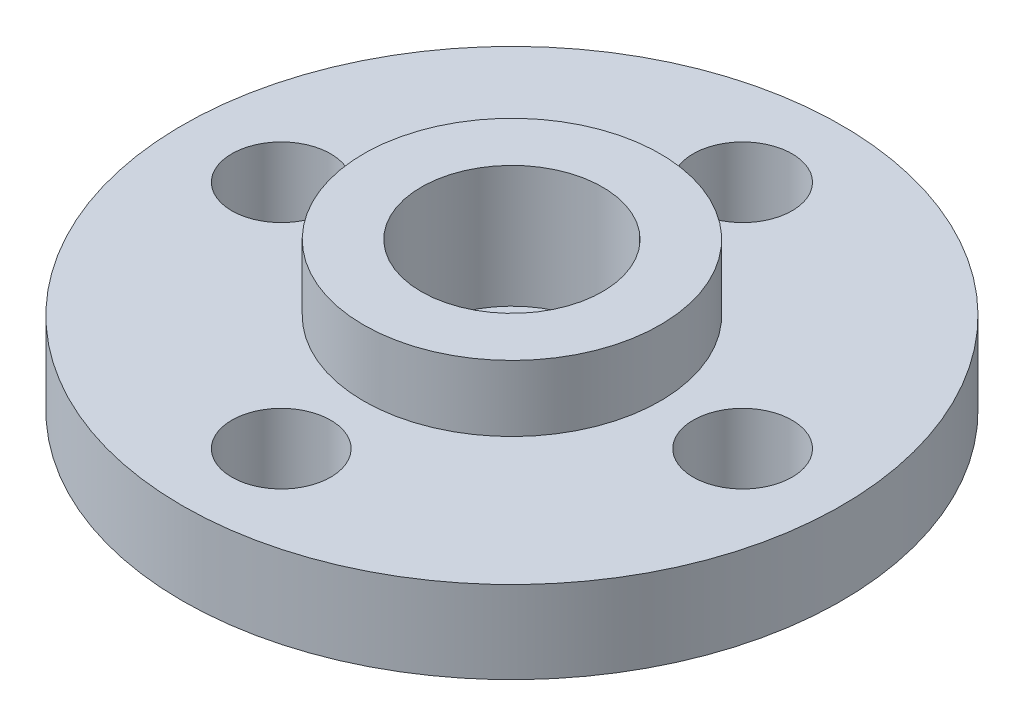
ISO-10303-21;
HEADER;
FILE_DESCRIPTION(('STEP AP214'),'2;1');
FILE_NAME('part.step','',(''),(''),'','','');
FILE_SCHEMA(('AUTOMOTIVE_DESIGN { 1 0 10303 214 1 1 1 1 }'));
ENDSEC;
DATA;
#1=APPLICATION_CONTEXT('core data for automotive mechanical design processes');
#2=APPLICATION_PROTOCOL_DEFINITION('international standard','automotive_design',2000,#1);
#3=PRODUCT_CONTEXT('',#1,'mechanical');
#4=PRODUCT('Part','Part','',(#3));
#5=PRODUCT_RELATED_PRODUCT_CATEGORY('part','',(#4));
#6=PRODUCT_DEFINITION_FORMATION('','',#4);
#7=PRODUCT_DEFINITION_CONTEXT('part definition',#1,'design');
#8=PRODUCT_DEFINITION('design','',#6,#7);
#9=PRODUCT_DEFINITION_SHAPE('','',#8);
#10=(LENGTH_UNIT() NAMED_UNIT(*) SI_UNIT(.MILLI.,.METRE.));
#11=(NAMED_UNIT(*) PLANE_ANGLE_UNIT() SI_UNIT($,.RADIAN.));
#12=(NAMED_UNIT(*) SI_UNIT($,.STERADIAN.) SOLID_ANGLE_UNIT());
#13=UNCERTAINTY_MEASURE_WITH_UNIT(LENGTH_MEASURE(1.E-05),#10,'distance_accuracy_value','');
#14=(GEOMETRIC_REPRESENTATION_CONTEXT(3) GLOBAL_UNCERTAINTY_ASSIGNED_CONTEXT((#13)) GLOBAL_UNIT_ASSIGNED_CONTEXT((#10,
#11,#12)) REPRESENTATION_CONTEXT('',''));
#15=CARTESIAN_POINT('',(0.,0.,0.));
#16=DIRECTION('',(0.,0.,1.));
#17=DIRECTION('',(1.,0.,0.));
#18=AXIS2_PLACEMENT_3D('',#15,#16,#17);
#19=CARTESIAN_POINT('',(0.,2.5,0.));
#20=DIRECTION('',(0.,-1.,0.));
#21=DIRECTION('',(0.,0.,-1.));
#22=AXIS2_PLACEMENT_3D('',#19,#20,#21);
#23=CYLINDRICAL_SURFACE('',#22,1.5);
#24=CARTESIAN_POINT('',(0.,0.,0.));
#25=DIRECTION('',(0.,1.,0.));
#26=DIRECTION('',(0.,0.,1.));
#27=AXIS2_PLACEMENT_3D('',#24,#25,#26);
#28=CIRCLE('',#27,1.5);
#29=CARTESIAN_POINT('',(0.,0.,1.5));
#30=VERTEX_POINT('',#29);
#31=EDGE_CURVE('E56',#30,#30,#28,.T.);
#32=ORIENTED_EDGE('',*,*,#31,.F.);
#33=EDGE_LOOP('',(#32));
#34=FACE_BOUND('',#33,.T.);
#35=CARTESIAN_POINT('',(0.,0.8,0.));
#36=DIRECTION('',(0.,1.,0.));
#37=DIRECTION('',(0.,0.,1.));
#38=AXIS2_PLACEMENT_3D('',#35,#36,#37);
#39=CIRCLE('',#38,1.5);
#40=CARTESIAN_POINT('',(0.,0.8,1.5));
#41=VERTEX_POINT('',#40);
#42=EDGE_CURVE('E44',#41,#41,#39,.T.);
#43=ORIENTED_EDGE('',*,*,#42,.T.);
#44=EDGE_LOOP('',(#43));
#45=FACE_BOUND('',#44,.T.);
#46=ADVANCED_FACE('F41',(#34,#45),#23,.F.);
#47=CARTESIAN_POINT('',(0.,2.5,0.));
#48=DIRECTION('',(0.,1.,0.));
#49=DIRECTION('',(0.,0.,1.));
#50=AXIS2_PLACEMENT_3D('',#47,#48,#49);
#51=PLANE('',#50);
#52=CARTESIAN_POINT('',(-7.,2.5,0.));
#53=DIRECTION('',(0.,1.,0.));
#54=DIRECTION('',(0.,0.,1.));
#55=AXIS2_PLACEMENT_3D('',#52,#53,#54);
#56=CIRCLE('',#55,1.50000000000007);
#57=CARTESIAN_POINT('',(-7.,2.5,1.50000000000007));
#58=VERTEX_POINT('',#57);
#59=EDGE_CURVE('E74',#58,#58,#56,.T.);
#60=ORIENTED_EDGE('',*,*,#59,.F.);
#61=EDGE_LOOP('',(#60));
#62=FACE_BOUND('',#61,.T.);
#63=CARTESIAN_POINT('',(7.,2.5,0.));
#64=DIRECTION('',(0.,1.,0.));
#65=DIRECTION('',(0.,0.,1.));
#66=AXIS2_PLACEMENT_3D('',#63,#64,#65);
#67=CIRCLE('',#66,1.50000000000002);
#68=CARTESIAN_POINT('',(7.,2.5,1.50000000000002));
#69=VERTEX_POINT('',#68);
#70=EDGE_CURVE('E61',#69,#69,#67,.T.);
#71=ORIENTED_EDGE('',*,*,#70,.F.);
#72=EDGE_LOOP('',(#71));
#73=FACE_BOUND('',#72,.T.);
#74=CARTESIAN_POINT('',(0.,2.5,-7.));
#75=DIRECTION('',(0.,1.,0.));
#76=DIRECTION('',(0.,0.,1.));
#77=AXIS2_PLACEMENT_3D('',#74,#75,#76);
#78=CIRCLE('',#77,1.5);
#79=CARTESIAN_POINT('',(0.,2.5,-5.5));
#80=VERTEX_POINT('',#79);
#81=EDGE_CURVE('E53',#80,#80,#78,.T.);
#82=ORIENTED_EDGE('',*,*,#81,.F.);
#83=EDGE_LOOP('',(#82));
#84=FACE_BOUND('',#83,.T.);
#85=CARTESIAN_POINT('',(0.,2.5,0.));
#86=DIRECTION('',(0.,1.,0.));
#87=DIRECTION('',(0.,0.,1.));
#88=AXIS2_PLACEMENT_3D('',#85,#86,#87);
#89=CIRCLE('',#88,10.);
#90=CARTESIAN_POINT('',(0.,2.5,10.));
#91=VERTEX_POINT('',#90);
#92=EDGE_CURVE('E10',#91,#91,#89,.T.);
#93=ORIENTED_EDGE('',*,*,#92,.T.);
#94=EDGE_LOOP('',(#93));
#95=FACE_BOUND('',#94,.T.);
#96=CARTESIAN_POINT('',(0.,2.5,7.));
#97=DIRECTION('',(0.,1.,0.));
#98=DIRECTION('',(0.,0.,1.));
#99=AXIS2_PLACEMENT_3D('',#96,#97,#98);
#100=CIRCLE('',#99,1.50000000000005);
#101=CARTESIAN_POINT('',(0.,2.5,8.50000000000005));
#102=VERTEX_POINT('',#101);
#103=EDGE_CURVE('E69',#102,#102,#100,.T.);
#104=ORIENTED_EDGE('',*,*,#103,.F.);
#105=EDGE_LOOP('',(#104));
#106=FACE_BOUND('',#105,.T.);
#107=CARTESIAN_POINT('',(0.,2.5,0.));
#108=DIRECTION('',(0.,1.,0.));
#109=DIRECTION('',(0.,0.,1.));
#110=AXIS2_PLACEMENT_3D('',#107,#108,#109);
#111=CIRCLE('',#110,4.5);
#112=CARTESIAN_POINT('',(0.,2.5,4.5));
#113=VERTEX_POINT('',#112);
#114=EDGE_CURVE('E84',#113,#113,#111,.T.);
#115=ORIENTED_EDGE('',*,*,#114,.F.);
#116=EDGE_LOOP('',(#115));
#117=FACE_BOUND('',#116,.T.);
#118=ADVANCED_FACE('F109',(#62,#73,#84,#95,#106,#117),#51,.T.);
#119=CARTESIAN_POINT('',(0.,0.,0.));
#120=DIRECTION('',(0.,1.,0.));
#121=DIRECTION('',(0.,0.,1.));
#122=AXIS2_PLACEMENT_3D('',#119,#120,#121);
#123=PLANE('',#122);
#124=CARTESIAN_POINT('',(0.,0.,0.));
#125=DIRECTION('',(0.,1.,0.));
#126=DIRECTION('',(0.,0.,1.));
#127=AXIS2_PLACEMENT_3D('',#124,#125,#126);
#128=CIRCLE('',#127,10.);
#129=CARTESIAN_POINT('',(0.,0.,10.));
#130=VERTEX_POINT('',#129);
#131=EDGE_CURVE('E47',#130,#130,#128,.T.);
#132=ORIENTED_EDGE('',*,*,#131,.F.);
#133=EDGE_LOOP('',(#132));
#134=FACE_BOUND('',#133,.T.);
#135=CARTESIAN_POINT('',(0.,0.,-7.));
#136=DIRECTION('',(0.,1.,0.));
#137=DIRECTION('',(0.,0.,1.));
#138=AXIS2_PLACEMENT_3D('',#135,#136,#137);
#139=CIRCLE('',#138,1.5);
#140=CARTESIAN_POINT('',(0.,0.,-5.5));
#141=VERTEX_POINT('',#140);
#142=EDGE_CURVE('E57',#141,#141,#139,.T.);
#143=ORIENTED_EDGE('',*,*,#142,.T.);
#144=EDGE_LOOP('',(#143));
#145=FACE_BOUND('',#144,.T.);
#146=ORIENTED_EDGE('',*,*,#31,.T.);
#147=EDGE_LOOP('',(#146));
#148=FACE_BOUND('',#147,.T.);
#149=CARTESIAN_POINT('',(7.,0.,0.));
#150=DIRECTION('',(0.,1.,0.));
#151=DIRECTION('',(0.,0.,1.));
#152=AXIS2_PLACEMENT_3D('',#149,#150,#151);
#153=CIRCLE('',#152,1.50000000000002);
#154=CARTESIAN_POINT('',(7.,0.,1.50000000000002));
#155=VERTEX_POINT('',#154);
#156=EDGE_CURVE('E63',#155,#155,#153,.T.);
#157=ORIENTED_EDGE('',*,*,#156,.T.);
#158=EDGE_LOOP('',(#157));
#159=FACE_BOUND('',#158,.T.);
#160=CARTESIAN_POINT('',(0.,0.,7.));
#161=DIRECTION('',(0.,1.,0.));
#162=DIRECTION('',(0.,0.,1.));
#163=AXIS2_PLACEMENT_3D('',#160,#161,#162);
#164=CIRCLE('',#163,1.50000000000005);
#165=CARTESIAN_POINT('',(0.,0.,8.50000000000005));
#166=VERTEX_POINT('',#165);
#167=EDGE_CURVE('E72',#166,#166,#164,.T.);
#168=ORIENTED_EDGE('',*,*,#167,.T.);
#169=EDGE_LOOP('',(#168));
#170=FACE_BOUND('',#169,.T.);
#171=CARTESIAN_POINT('',(-7.,0.,0.));
#172=DIRECTION('',(0.,1.,0.));
#173=DIRECTION('',(0.,0.,1.));
#174=AXIS2_PLACEMENT_3D('',#171,#172,#173);
#175=CIRCLE('',#174,1.50000000000007);
#176=CARTESIAN_POINT('',(-7.,0.,1.50000000000007));
#177=VERTEX_POINT('',#176);
#178=EDGE_CURVE('E80',#177,#177,#175,.T.);
#179=ORIENTED_EDGE('',*,*,#178,.T.);
#180=EDGE_LOOP('',(#179));
#181=FACE_BOUND('',#180,.T.);
#182=ADVANCED_FACE('F119',(#134,#145,#148,#159,#170,#181),#123,.F.);
#183=CARTESIAN_POINT('',(0.,2.5,0.));
#184=DIRECTION('',(0.,-1.,0.));
#185=DIRECTION('',(0.,0.,-1.));
#186=AXIS2_PLACEMENT_3D('',#183,#184,#185);
#187=CYLINDRICAL_SURFACE('',#186,10.);
#188=ORIENTED_EDGE('',*,*,#92,.F.);
#189=EDGE_LOOP('',(#188));
#190=FACE_BOUND('',#189,.T.);
#191=ORIENTED_EDGE('',*,*,#131,.T.);
#192=EDGE_LOOP('',(#191));
#193=FACE_BOUND('',#192,.T.);
#194=ADVANCED_FACE('F43',(#190,#193),#187,.T.);
#195=CARTESIAN_POINT('',(0.,2.5,-7.));
#196=DIRECTION('',(0.,-1.,0.));
#197=DIRECTION('',(0.,0.,-1.));
#198=AXIS2_PLACEMENT_3D('',#195,#196,#197);
#199=CYLINDRICAL_SURFACE('',#198,1.5);
#200=ORIENTED_EDGE('',*,*,#81,.T.);
#201=EDGE_LOOP('',(#200));
#202=FACE_BOUND('',#201,.T.);
#203=ORIENTED_EDGE('',*,*,#142,.F.);
#204=EDGE_LOOP('',(#203));
#205=FACE_BOUND('',#204,.T.);
#206=ADVANCED_FACE('F127',(#202,#205),#199,.F.);
#207=CARTESIAN_POINT('',(7.,2.5,0.));
#208=DIRECTION('',(0.,-1.,0.));
#209=DIRECTION('',(0.,0.,-1.));
#210=AXIS2_PLACEMENT_3D('',#207,#208,#209);
#211=CYLINDRICAL_SURFACE('',#210,1.50000000000002);
#212=ORIENTED_EDGE('',*,*,#70,.T.);
#213=EDGE_LOOP('',(#212));
#214=FACE_BOUND('',#213,.T.);
#215=ORIENTED_EDGE('',*,*,#156,.F.);
#216=EDGE_LOOP('',(#215));
#217=FACE_BOUND('',#216,.T.);
#218=ADVANCED_FACE('F121',(#214,#217),#211,.F.);
#219=CARTESIAN_POINT('',(0.,2.5,7.));
#220=DIRECTION('',(0.,-1.,0.));
#221=DIRECTION('',(0.,0.,-1.));
#222=AXIS2_PLACEMENT_3D('',#219,#220,#221);
#223=CYLINDRICAL_SURFACE('',#222,1.50000000000005);
#224=ORIENTED_EDGE('',*,*,#103,.T.);
#225=EDGE_LOOP('',(#224));
#226=FACE_BOUND('',#225,.T.);
#227=ORIENTED_EDGE('',*,*,#167,.F.);
#228=EDGE_LOOP('',(#227));
#229=FACE_BOUND('',#228,.T.);
#230=ADVANCED_FACE('F149',(#226,#229),#223,.F.);
#231=CARTESIAN_POINT('',(-7.,2.5,0.));
#232=DIRECTION('',(0.,-1.,0.));
#233=DIRECTION('',(0.,0.,-1.));
#234=AXIS2_PLACEMENT_3D('',#231,#232,#233);
#235=CYLINDRICAL_SURFACE('',#234,1.50000000000007);
#236=ORIENTED_EDGE('',*,*,#59,.T.);
#237=EDGE_LOOP('',(#236));
#238=FACE_BOUND('',#237,.T.);
#239=ORIENTED_EDGE('',*,*,#178,.F.);
#240=EDGE_LOOP('',(#239));
#241=FACE_BOUND('',#240,.T.);
#242=ADVANCED_FACE('F148',(#238,#241),#235,.F.);
#243=CARTESIAN_POINT('',(0.,4.5,0.));
#244=DIRECTION('',(0.,1.,0.));
#245=DIRECTION('',(0.,0.,1.));
#246=AXIS2_PLACEMENT_3D('',#243,#244,#245);
#247=PLANE('',#246);
#248=CARTESIAN_POINT('',(0.,4.5,0.));
#249=DIRECTION('',(0.,1.,0.));
#250=DIRECTION('',(0.,0.,1.));
#251=AXIS2_PLACEMENT_3D('',#248,#249,#250);
#252=CIRCLE('',#251,2.75);
#253=CARTESIAN_POINT('',(0.,4.5,2.75));
#254=VERTEX_POINT('',#253);
#255=EDGE_CURVE('E86',#254,#254,#252,.T.);
#256=ORIENTED_EDGE('',*,*,#255,.F.);
#257=EDGE_LOOP('',(#256));
#258=FACE_BOUND('',#257,.T.);
#259=CARTESIAN_POINT('',(0.,4.5,0.));
#260=DIRECTION('',(0.,1.,0.));
#261=DIRECTION('',(0.,0.,1.));
#262=AXIS2_PLACEMENT_3D('',#259,#260,#261);
#263=CIRCLE('',#262,4.5);
#264=CARTESIAN_POINT('',(0.,4.5,4.5));
#265=VERTEX_POINT('',#264);
#266=EDGE_CURVE('E78',#265,#265,#263,.T.);
#267=ORIENTED_EDGE('',*,*,#266,.T.);
#268=EDGE_LOOP('',(#267));
#269=FACE_BOUND('',#268,.T.);
#270=ADVANCED_FACE('F146',(#258,#269),#247,.T.);
#271=CARTESIAN_POINT('',(0.,4.5,0.));
#272=DIRECTION('',(0.,-1.,0.));
#273=DIRECTION('',(0.,0.,-1.));
#274=AXIS2_PLACEMENT_3D('',#271,#272,#273);
#275=CYLINDRICAL_SURFACE('',#274,4.5);
#276=ORIENTED_EDGE('',*,*,#266,.F.);
#277=EDGE_LOOP('',(#276));
#278=FACE_BOUND('',#277,.T.);
#279=ORIENTED_EDGE('',*,*,#114,.T.);
#280=EDGE_LOOP('',(#279));
#281=FACE_BOUND('',#280,.T.);
#282=ADVANCED_FACE('F106',(#278,#281),#275,.T.);
#283=CARTESIAN_POINT('',(0.,0.8,0.));
#284=DIRECTION('',(0.,1.,0.));
#285=DIRECTION('',(0.,0.,1.));
#286=AXIS2_PLACEMENT_3D('',#283,#284,#285);
#287=CYLINDRICAL_SURFACE('',#286,2.75);
#288=CARTESIAN_POINT('',(0.,0.8,0.));
#289=DIRECTION('',(0.,1.,0.));
#290=DIRECTION('',(0.,0.,1.));
#291=AXIS2_PLACEMENT_3D('',#288,#289,#290);
#292=CIRCLE('',#291,2.75);
#293=CARTESIAN_POINT('',(0.,0.8,2.75));
#294=VERTEX_POINT('',#293);
#295=EDGE_CURVE('E93',#294,#294,#292,.T.);
#296=ORIENTED_EDGE('',*,*,#295,.F.);
#297=EDGE_LOOP('',(#296));
#298=FACE_BOUND('',#297,.T.);
#299=ORIENTED_EDGE('',*,*,#255,.T.);
#300=EDGE_LOOP('',(#299));
#301=FACE_BOUND('',#300,.T.);
#302=ADVANCED_FACE('F101',(#298,#301),#287,.F.);
#303=CARTESIAN_POINT('',(0.,0.8,0.));
#304=DIRECTION('',(0.,1.,0.));
#305=DIRECTION('',(0.,0.,1.));
#306=AXIS2_PLACEMENT_3D('',#303,#304,#305);
#307=PLANE('',#306);
#308=ORIENTED_EDGE('',*,*,#42,.F.);
#309=EDGE_LOOP('',(#308));
#310=FACE_BOUND('',#309,.T.);
#311=ORIENTED_EDGE('',*,*,#295,.T.);
#312=EDGE_LOOP('',(#311));
#313=FACE_BOUND('',#312,.T.);
#314=ADVANCED_FACE('F97',(#310,#313),#307,.T.);
#315=CLOSED_SHELL('',(#46,#118,#182,#194,#206,#218,#230,#242,#270,#282,#302,#314));
#316=MANIFOLD_SOLID_BREP('B2',#315);
#317=ADVANCED_BREP_SHAPE_REPRESENTATION('',(#18,#316),#14);
#318=SHAPE_DEFINITION_REPRESENTATION(#9,#317);
ENDSEC;
END-ISO-10303-21;
